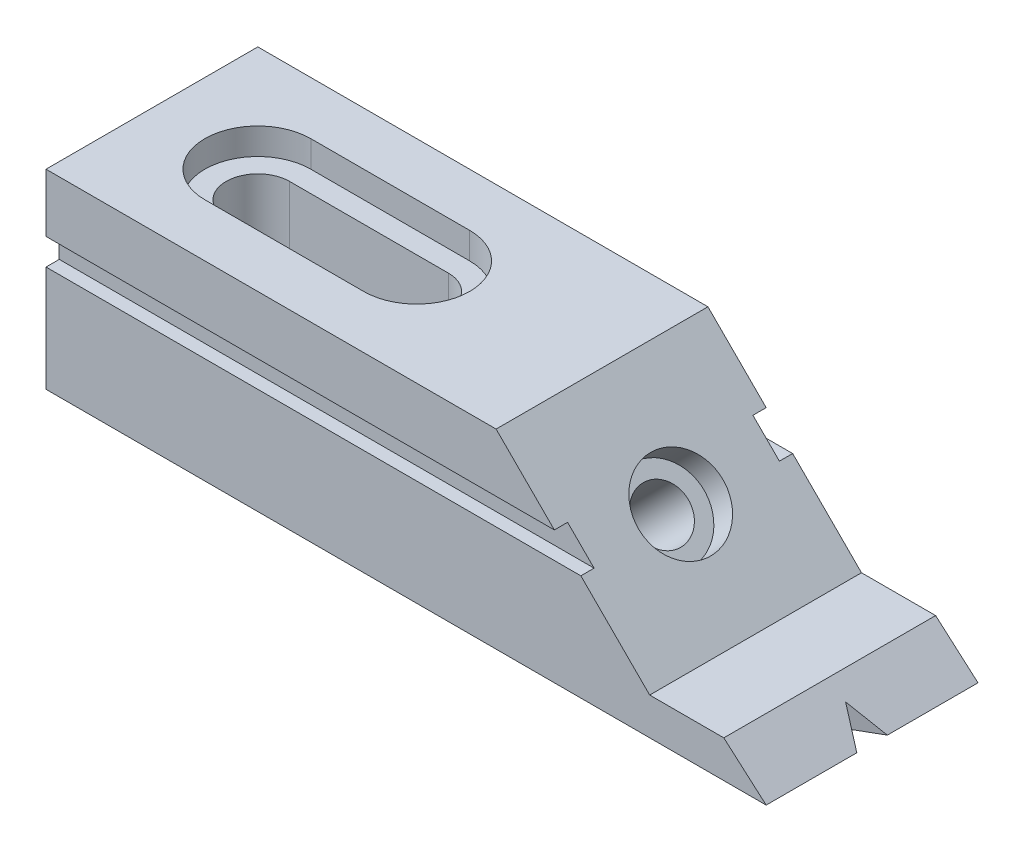
ISO-10303-21;
HEADER;
FILE_DESCRIPTION(('STEP AP214'),'2;1');
FILE_NAME('part.step','',(''),(''),'','','');
FILE_SCHEMA(('AUTOMOTIVE_DESIGN { 1 0 10303 214 1 1 1 1 }'));
ENDSEC;
DATA;
#1=APPLICATION_CONTEXT('core data for automotive mechanical design processes');
#2=APPLICATION_PROTOCOL_DEFINITION('international standard','automotive_design',2000,#1);
#3=PRODUCT_CONTEXT('',#1,'mechanical');
#4=PRODUCT('Part','Part','',(#3));
#5=PRODUCT_RELATED_PRODUCT_CATEGORY('part','',(#4));
#6=PRODUCT_DEFINITION_FORMATION('','',#4);
#7=PRODUCT_DEFINITION_CONTEXT('part definition',#1,'design');
#8=PRODUCT_DEFINITION('design','',#6,#7);
#9=PRODUCT_DEFINITION_SHAPE('','',#8);
#10=(LENGTH_UNIT() NAMED_UNIT(*) SI_UNIT(.MILLI.,.METRE.));
#11=(NAMED_UNIT(*) PLANE_ANGLE_UNIT() SI_UNIT($,.RADIAN.));
#12=(NAMED_UNIT(*) SI_UNIT($,.STERADIAN.) SOLID_ANGLE_UNIT());
#13=UNCERTAINTY_MEASURE_WITH_UNIT(LENGTH_MEASURE(1.E-05),#10,'distance_accuracy_value','');
#14=(GEOMETRIC_REPRESENTATION_CONTEXT(3) GLOBAL_UNCERTAINTY_ASSIGNED_CONTEXT((#13)) GLOBAL_UNIT_ASSIGNED_CONTEXT((#10,
#11,#12)) REPRESENTATION_CONTEXT('',''));
#15=CARTESIAN_POINT('',(0.,0.,0.));
#16=DIRECTION('',(0.,0.,1.));
#17=DIRECTION('',(1.,0.,0.));
#18=AXIS2_PLACEMENT_3D('',#15,#16,#17);
#19=CARTESIAN_POINT('',(0.,45.72,25.4));
#20=DIRECTION('',(1.,0.,0.));
#21=DIRECTION('',(0.,0.,-1.));
#22=AXIS2_PLACEMENT_3D('',#19,#20,#21);
#23=PLANE('',#22);
#24=DIRECTION('',(0.,0.,-1.));
#25=VECTOR('',#24,1.);
#26=CARTESIAN_POINT('',(0.,25.4,22.225));
#27=LINE('',#26,#25);
#28=CARTESIAN_POINT('',(0.,25.4,25.4));
#29=VERTEX_POINT('',#28);
#30=CARTESIAN_POINT('',(0.,25.4,22.225));
#31=VERTEX_POINT('',#30);
#32=EDGE_CURVE('E297',#29,#31,#27,.T.);
#33=ORIENTED_EDGE('',*,*,#32,.T.);
#34=DIRECTION('',(0.,1.,0.));
#35=VECTOR('',#34,1.);
#36=CARTESIAN_POINT('',(0.,31.75,22.225));
#37=LINE('',#36,#35);
#38=CARTESIAN_POINT('',(0.,31.75,22.225));
#39=VERTEX_POINT('',#38);
#40=EDGE_CURVE('E301',#31,#39,#37,.T.);
#41=ORIENTED_EDGE('',*,*,#40,.T.);
#42=DIRECTION('',(0.,0.,1.));
#43=VECTOR('',#42,1.);
#44=CARTESIAN_POINT('',(0.,31.75,25.4));
#45=LINE('',#44,#43);
#46=CARTESIAN_POINT('',(0.,31.75,25.4));
#47=VERTEX_POINT('',#46);
#48=EDGE_CURVE('E306',#39,#47,#45,.T.);
#49=ORIENTED_EDGE('',*,*,#48,.T.);
#50=DIRECTION('',(0.,-1.,0.));
#51=VECTOR('',#50,1.);
#52=CARTESIAN_POINT('',(0.,45.72,25.4));
#53=LINE('',#52,#51);
#54=CARTESIAN_POINT('',(0.,45.72,25.4));
#55=VERTEX_POINT('',#54);
#56=EDGE_CURVE('E370',#55,#47,#53,.T.);
#57=ORIENTED_EDGE('',*,*,#56,.F.);
#58=DIRECTION('',(0.,0.,-1.));
#59=VECTOR('',#58,1.);
#60=CARTESIAN_POINT('',(0.,45.72,25.4));
#61=LINE('',#60,#59);
#62=CARTESIAN_POINT('',(0.,45.72,-25.4));
#63=VERTEX_POINT('',#62);
#64=EDGE_CURVE('E392',#55,#63,#61,.T.);
#65=ORIENTED_EDGE('',*,*,#64,.T.);
#66=DIRECTION('',(0.,-1.,0.));
#67=VECTOR('',#66,1.);
#68=CARTESIAN_POINT('',(0.,45.72,-25.4));
#69=LINE('',#68,#67);
#70=CARTESIAN_POINT('',(0.,31.75,-25.4));
#71=VERTEX_POINT('',#70);
#72=EDGE_CURVE('E393',#63,#71,#69,.T.);
#73=ORIENTED_EDGE('',*,*,#72,.T.);
#74=DIRECTION('',(0.,0.,1.));
#75=VECTOR('',#74,1.);
#76=CARTESIAN_POINT('',(0.,31.75,-25.4));
#77=LINE('',#76,#75);
#78=CARTESIAN_POINT('',(0.,31.75,-22.225));
#79=VERTEX_POINT('',#78);
#80=EDGE_CURVE('E302',#71,#79,#77,.T.);
#81=ORIENTED_EDGE('',*,*,#80,.T.);
#82=DIRECTION('',(0.,-1.,0.));
#83=VECTOR('',#82,1.);
#84=CARTESIAN_POINT('',(0.,31.75,-22.225));
#85=LINE('',#84,#83);
#86=CARTESIAN_POINT('',(0.,25.4,-22.225));
#87=VERTEX_POINT('',#86);
#88=EDGE_CURVE('E326',#79,#87,#85,.T.);
#89=ORIENTED_EDGE('',*,*,#88,.T.);
#90=DIRECTION('',(0.,0.,-1.));
#91=VECTOR('',#90,1.);
#92=CARTESIAN_POINT('',(0.,25.4,-22.225));
#93=LINE('',#92,#91);
#94=CARTESIAN_POINT('',(0.,25.4,-25.4));
#95=VERTEX_POINT('',#94);
#96=EDGE_CURVE('E322',#87,#95,#93,.T.);
#97=ORIENTED_EDGE('',*,*,#96,.T.);
#98=CARTESIAN_POINT('',(0.,0.,-25.4));
#99=VERTEX_POINT('',#98);
#100=EDGE_CURVE('E369',#95,#99,#69,.T.);
#101=ORIENTED_EDGE('',*,*,#100,.T.);
#102=DIRECTION('',(0.,0.,-1.));
#103=VECTOR('',#102,1.);
#104=CARTESIAN_POINT('',(0.,0.,25.4));
#105=LINE('',#104,#103);
#106=CARTESIAN_POINT('',(0.,0.,25.4));
#107=VERTEX_POINT('',#106);
#108=EDGE_CURVE('E435',#107,#99,#105,.T.);
#109=ORIENTED_EDGE('',*,*,#108,.F.);
#110=EDGE_CURVE('E375',#29,#107,#53,.T.);
#111=ORIENTED_EDGE('',*,*,#110,.F.);
#112=EDGE_LOOP('',(#33,#41,#49,#57,#65,#73,#81,#89,#97,#101,#109,#111));
#113=FACE_BOUND('',#112,.T.);
#114=ADVANCED_FACE('F43',(#113),#23,.F.);
#115=CARTESIAN_POINT('',(144.78,8.89,25.4));
#116=DIRECTION('',(-0.707106781186548,-0.707106781186547,0.));
#117=DIRECTION('',(0.707106781186547,-0.707106781186548,0.));
#118=AXIS2_PLACEMENT_3D('',#115,#116,#117);
#119=PLANE('',#118);
#120=CARTESIAN_POINT('',(126.819487757862,26.8505122421383,0.));
#121=DIRECTION('',(0.707106781186548,0.707106781186547,0.));
#122=DIRECTION('',(-0.707106781186547,0.707106781186548,0.));
#123=AXIS2_PLACEMENT_3D('',#120,#121,#122);
#124=CIRCLE('',#123,10.16);
#125=CARTESIAN_POINT('',(119.635282861006,34.0347171389937,0.));
#126=VERTEX_POINT('',#125);
#127=EDGE_CURVE('E356',#126,#126,#124,.T.);
#128=ORIENTED_EDGE('',*,*,#127,.F.);
#129=EDGE_LOOP('',(#128));
#130=FACE_BOUND('',#129,.T.);
#131=DIRECTION('',(0.,0.,-1.));
#132=VECTOR('',#131,1.);
#133=CARTESIAN_POINT('',(128.27,25.4,25.4));
#134=LINE('',#133,#132);
#135=CARTESIAN_POINT('',(128.27,25.4,25.4));
#136=VERTEX_POINT('',#135);
#137=CARTESIAN_POINT('',(128.27,25.4,22.225));
#138=VERTEX_POINT('',#137);
#139=EDGE_CURVE('E341',#136,#138,#134,.T.);
#140=ORIENTED_EDGE('',*,*,#139,.F.);
#141=DIRECTION('',(-0.707106781186547,0.707106781186548,0.));
#142=VECTOR('',#141,1.);
#143=CARTESIAN_POINT('',(144.78,8.89,25.4));
#144=LINE('',#143,#142);
#145=CARTESIAN_POINT('',(144.78,8.89,25.4));
#146=VERTEX_POINT('',#145);
#147=EDGE_CURVE('E385',#146,#136,#144,.T.);
#148=ORIENTED_EDGE('',*,*,#147,.F.);
#149=DIRECTION('',(0.,0.,-1.));
#150=VECTOR('',#149,1.);
#151=CARTESIAN_POINT('',(144.78,8.89,25.4));
#152=LINE('',#151,#150);
#153=CARTESIAN_POINT('',(144.78,8.89,-25.4));
#154=VERTEX_POINT('',#153);
#155=EDGE_CURVE('E422',#146,#154,#152,.T.);
#156=ORIENTED_EDGE('',*,*,#155,.T.);
#157=DIRECTION('',(-0.707106781186547,0.707106781186548,0.));
#158=VECTOR('',#157,1.);
#159=CARTESIAN_POINT('',(144.78,8.89,-25.4));
#160=LINE('',#159,#158);
#161=CARTESIAN_POINT('',(128.27,25.4,-25.4));
#162=VERTEX_POINT('',#161);
#163=EDGE_CURVE('E408',#154,#162,#160,.T.);
#164=ORIENTED_EDGE('',*,*,#163,.T.);
#165=DIRECTION('',(0.,0.,-1.));
#166=VECTOR('',#165,1.);
#167=CARTESIAN_POINT('',(128.27,25.4,25.4));
#168=LINE('',#167,#166);
#169=CARTESIAN_POINT('',(128.27,25.4,-22.225));
#170=VERTEX_POINT('',#169);
#171=EDGE_CURVE('E316',#170,#162,#168,.T.);
#172=ORIENTED_EDGE('',*,*,#171,.F.);
#173=DIRECTION('',(0.707106781186547,-0.707106781186548,0.));
#174=VECTOR('',#173,1.);
#175=CARTESIAN_POINT('',(144.78,8.89,-22.225));
#176=LINE('',#175,#174);
#177=CARTESIAN_POINT('',(121.92,31.75,-22.225));
#178=VERTEX_POINT('',#177);
#179=EDGE_CURVE('E51',#178,#170,#176,.T.);
#180=ORIENTED_EDGE('',*,*,#179,.F.);
#181=DIRECTION('',(0.,0.,1.));
#182=VECTOR('',#181,1.);
#183=CARTESIAN_POINT('',(121.92,31.75,25.4));
#184=LINE('',#183,#182);
#185=CARTESIAN_POINT('',(121.92,31.75,-25.4));
#186=VERTEX_POINT('',#185);
#187=EDGE_CURVE('E335',#186,#178,#184,.T.);
#188=ORIENTED_EDGE('',*,*,#187,.F.);
#189=CARTESIAN_POINT('',(107.95,45.72,-25.4));
#190=VERTEX_POINT('',#189);
#191=EDGE_CURVE('E407',#186,#190,#160,.T.);
#192=ORIENTED_EDGE('',*,*,#191,.T.);
#193=DIRECTION('',(0.,0.,-1.));
#194=VECTOR('',#193,1.);
#195=CARTESIAN_POINT('',(107.95,45.72,25.4));
#196=LINE('',#195,#194);
#197=CARTESIAN_POINT('',(107.95,45.72,25.4));
#198=VERTEX_POINT('',#197);
#199=EDGE_CURVE('E418',#198,#190,#196,.T.);
#200=ORIENTED_EDGE('',*,*,#199,.F.);
#201=CARTESIAN_POINT('',(121.92,31.75,25.4));
#202=VERTEX_POINT('',#201);
#203=EDGE_CURVE('E384',#202,#198,#144,.T.);
#204=ORIENTED_EDGE('',*,*,#203,.F.);
#205=DIRECTION('',(0.,0.,1.));
#206=VECTOR('',#205,1.);
#207=CARTESIAN_POINT('',(121.92,31.75,25.4));
#208=LINE('',#207,#206);
#209=CARTESIAN_POINT('',(121.92,31.75,22.225));
#210=VERTEX_POINT('',#209);
#211=EDGE_CURVE('E338',#210,#202,#208,.T.);
#212=ORIENTED_EDGE('',*,*,#211,.F.);
#213=DIRECTION('',(-0.707106781186547,0.707106781186548,0.));
#214=VECTOR('',#213,1.);
#215=CARTESIAN_POINT('',(144.78,8.89,22.225));
#216=LINE('',#215,#214);
#217=EDGE_CURVE('E11',#138,#210,#216,.T.);
#218=ORIENTED_EDGE('',*,*,#217,.F.);
#219=EDGE_LOOP('',(#140,#148,#156,#164,#172,#180,#188,#192,#200,#204,#212,#218));
#220=FACE_BOUND('',#219,.T.);
#221=ADVANCED_FACE('F478',(#130,#220),#119,.F.);
#222=CARTESIAN_POINT('',(0.,0.,25.4));
#223=DIRECTION('',(0.,0.,1.));
#224=DIRECTION('',(1.,0.,0.));
#225=AXIS2_PLACEMENT_3D('',#222,#223,#224);
#226=PLANE('',#225);
#227=ORIENTED_EDGE('',*,*,#147,.T.);
#228=DIRECTION('',(-1.,0.,0.));
#229=VECTOR('',#228,1.);
#230=CARTESIAN_POINT('',(0.,25.4,25.4));
#231=LINE('',#230,#229);
#232=EDGE_CURVE('E460',#136,#29,#231,.T.);
#233=ORIENTED_EDGE('',*,*,#232,.T.);
#234=ORIENTED_EDGE('',*,*,#110,.T.);
#235=DIRECTION('',(1.,0.,0.));
#236=VECTOR('',#235,1.);
#237=CARTESIAN_POINT('',(0.,0.,25.4));
#238=LINE('',#237,#236);
#239=CARTESIAN_POINT('',(172.72,0.,25.4));
#240=VERTEX_POINT('',#239);
#241=EDGE_CURVE('E374',#107,#240,#238,.T.);
#242=ORIENTED_EDGE('',*,*,#241,.T.);
#243=DIRECTION('',(-0.752576694706881,0.658504607868515,0.));
#244=VECTOR('',#243,1.);
#245=CARTESIAN_POINT('',(172.72,0.,25.4));
#246=LINE('',#245,#244);
#247=CARTESIAN_POINT('',(162.56,8.89,25.4));
#248=VERTEX_POINT('',#247);
#249=EDGE_CURVE('E378',#240,#248,#246,.T.);
#250=ORIENTED_EDGE('',*,*,#249,.T.);
#251=DIRECTION('',(-1.,0.,0.));
#252=VECTOR('',#251,1.);
#253=CARTESIAN_POINT('',(162.56,8.89,25.4));
#254=LINE('',#253,#252);
#255=EDGE_CURVE('E381',#248,#146,#254,.T.);
#256=ORIENTED_EDGE('',*,*,#255,.T.);
#257=EDGE_LOOP('',(#227,#233,#234,#242,#250,#256));
#258=FACE_BOUND('',#257,.T.);
#259=ADVANCED_FACE('F513',(#258),#226,.T.);
#260=ORIENTED_EDGE('',*,*,#56,.T.);
#261=DIRECTION('',(1.,0.,0.));
#262=VECTOR('',#261,1.);
#263=CARTESIAN_POINT('',(0.,31.75,25.4));
#264=LINE('',#263,#262);
#265=EDGE_CURVE('E456',#47,#202,#264,.T.);
#266=ORIENTED_EDGE('',*,*,#265,.T.);
#267=ORIENTED_EDGE('',*,*,#203,.T.);
#268=DIRECTION('',(-1.,0.,0.));
#269=VECTOR('',#268,1.);
#270=CARTESIAN_POINT('',(107.95,45.72,25.4));
#271=LINE('',#270,#269);
#272=EDGE_CURVE('E389',#198,#55,#271,.T.);
#273=ORIENTED_EDGE('',*,*,#272,.T.);
#274=EDGE_LOOP('',(#260,#266,#267,#273));
#275=FACE_BOUND('',#274,.T.);
#276=ADVANCED_FACE('F529',(#275),#226,.T.);
#277=CARTESIAN_POINT('',(0.,0.,-25.4));
#278=DIRECTION('',(0.,0.,1.));
#279=DIRECTION('',(1.,0.,0.));
#280=AXIS2_PLACEMENT_3D('',#277,#278,#279);
#281=PLANE('',#280);
#282=DIRECTION('',(1.,0.,0.));
#283=VECTOR('',#282,1.);
#284=CARTESIAN_POINT('',(0.,31.75,-25.4));
#285=LINE('',#284,#283);
#286=EDGE_CURVE('E453',#71,#186,#285,.T.);
#287=ORIENTED_EDGE('',*,*,#286,.F.);
#288=ORIENTED_EDGE('',*,*,#72,.F.);
#289=DIRECTION('',(-1.,0.,0.));
#290=VECTOR('',#289,1.);
#291=CARTESIAN_POINT('',(107.95,45.72,-25.4));
#292=LINE('',#291,#290);
#293=EDGE_CURVE('E412',#190,#63,#292,.T.);
#294=ORIENTED_EDGE('',*,*,#293,.F.);
#295=ORIENTED_EDGE('',*,*,#191,.F.);
#296=EDGE_LOOP('',(#287,#288,#294,#295));
#297=FACE_BOUND('',#296,.T.);
#298=ADVANCED_FACE('F496',(#297),#281,.F.);
#299=DIRECTION('',(-1.,0.,0.));
#300=VECTOR('',#299,1.);
#301=CARTESIAN_POINT('',(0.,25.4,-25.4));
#302=LINE('',#301,#300);
#303=EDGE_CURVE('E450',#162,#95,#302,.T.);
#304=ORIENTED_EDGE('',*,*,#303,.F.);
#305=ORIENTED_EDGE('',*,*,#163,.F.);
#306=DIRECTION('',(-1.,0.,0.));
#307=VECTOR('',#306,1.);
#308=CARTESIAN_POINT('',(162.56,8.89,-25.4));
#309=LINE('',#308,#307);
#310=CARTESIAN_POINT('',(162.56,8.89,-25.4));
#311=VERTEX_POINT('',#310);
#312=EDGE_CURVE('E404',#311,#154,#309,.T.);
#313=ORIENTED_EDGE('',*,*,#312,.F.);
#314=DIRECTION('',(-0.752576694706881,0.658504607868515,0.));
#315=VECTOR('',#314,1.);
#316=CARTESIAN_POINT('',(172.72,0.,-25.4));
#317=LINE('',#316,#315);
#318=CARTESIAN_POINT('',(172.72,0.,-25.4));
#319=VERTEX_POINT('',#318);
#320=EDGE_CURVE('E401',#319,#311,#317,.T.);
#321=ORIENTED_EDGE('',*,*,#320,.F.);
#322=DIRECTION('',(1.,0.,0.));
#323=VECTOR('',#322,1.);
#324=CARTESIAN_POINT('',(0.,0.,-25.4));
#325=LINE('',#324,#323);
#326=EDGE_CURVE('E397',#99,#319,#325,.T.);
#327=ORIENTED_EDGE('',*,*,#326,.F.);
#328=ORIENTED_EDGE('',*,*,#100,.F.);
#329=EDGE_LOOP('',(#304,#305,#313,#321,#327,#328));
#330=FACE_BOUND('',#329,.T.);
#331=ADVANCED_FACE('F484',(#330),#281,.F.);
#332=CARTESIAN_POINT('',(49.9844877578615,-49.9844877578616,0.));
#333=DIRECTION('',(0.707106781186548,0.707106781186547,0.));
#334=DIRECTION('',(-0.707106781186547,0.707106781186548,0.));
#335=AXIS2_PLACEMENT_3D('',#332,#333,#334);
#336=CYLINDRICAL_SURFACE('',#335,6.34999999999999);
#337=CARTESIAN_POINT('',(99.9689755157232,0.,0.));
#338=DIRECTION('',(0.,1.,0.));
#339=DIRECTION('',(1.,0.,0.));
#340=AXIS2_PLACEMENT_3D('',#337,#338,#339);
#341=ELLIPSE('',#340,8.98025612106916,6.34999999999999);
#342=CARTESIAN_POINT('',(108.949231636792,0.,0.));
#343=VERTEX_POINT('',#342);
#344=EDGE_CURVE('E365',#343,#343,#341,.T.);
#345=ORIENTED_EDGE('',*,*,#344,.F.);
#346=EDGE_LOOP('',(#345));
#347=FACE_BOUND('',#346,.T.);
#348=CARTESIAN_POINT('',(122.329359697327,22.3603841816038,0.));
#349=DIRECTION('',(0.707106781186548,0.707106781186547,0.));
#350=DIRECTION('',(-0.707106781186547,0.707106781186548,0.));
#351=AXIS2_PLACEMENT_3D('',#348,#349,#350);
#352=CIRCLE('',#351,6.34999999999999);
#353=CARTESIAN_POINT('',(117.839231636792,26.8505122421384,0.));
#354=VERTEX_POINT('',#353);
#355=EDGE_CURVE('E361',#354,#354,#352,.F.);
#356=ORIENTED_EDGE('',*,*,#355,.F.);
#357=EDGE_LOOP('',(#356));
#358=FACE_BOUND('',#357,.T.);
#359=ADVANCED_FACE('F564',(#347,#358),#336,.F.);
#360=CARTESIAN_POINT('',(0.,0.,25.4));
#361=DIRECTION('',(0.,1.,0.));
#362=DIRECTION('',(0.,0.,1.));
#363=AXIS2_PLACEMENT_3D('',#360,#361,#362);
#364=PLANE('',#363);
#365=DIRECTION('',(-1.,0.,0.));
#366=VECTOR('',#365,1.);
#367=CARTESIAN_POINT('',(63.5,0.,-7.62));
#368=LINE('',#367,#366);
#369=CARTESIAN_POINT('',(63.5,0.,-7.62));
#370=VERTEX_POINT('',#369);
#371=CARTESIAN_POINT('',(25.4,0.,-7.62));
#372=VERTEX_POINT('',#371);
#373=EDGE_CURVE('E215',#370,#372,#368,.T.);
#374=ORIENTED_EDGE('',*,*,#373,.T.);
#375=CARTESIAN_POINT('',(25.4,0.,0.));
#376=DIRECTION('',(0.,1.,0.));
#377=DIRECTION('',(-1.,0.,0.));
#378=AXIS2_PLACEMENT_3D('',#375,#376,#377);
#379=CIRCLE('',#378,7.62);
#380=CARTESIAN_POINT('',(25.4,0.,7.62));
#381=VERTEX_POINT('',#380);
#382=EDGE_CURVE('E206',#372,#381,#379,.T.);
#383=ORIENTED_EDGE('',*,*,#382,.T.);
#384=DIRECTION('',(1.,0.,0.));
#385=VECTOR('',#384,1.);
#386=CARTESIAN_POINT('',(25.4,0.,7.62));
#387=LINE('',#386,#385);
#388=CARTESIAN_POINT('',(63.5,0.,7.62));
#389=VERTEX_POINT('',#388);
#390=EDGE_CURVE('E218',#381,#389,#387,.T.);
#391=ORIENTED_EDGE('',*,*,#390,.T.);
#392=CARTESIAN_POINT('',(63.5,0.,0.));
#393=DIRECTION('',(0.,1.,0.));
#394=DIRECTION('',(-1.,0.,0.));
#395=AXIS2_PLACEMENT_3D('',#392,#393,#394);
#396=CIRCLE('',#395,7.62);
#397=EDGE_CURVE('E63',#389,#370,#396,.T.);
#398=ORIENTED_EDGE('',*,*,#397,.T.);
#399=EDGE_LOOP('',(#374,#383,#391,#398));
#400=FACE_BOUND('',#399,.T.);
#401=ORIENTED_EDGE('',*,*,#344,.T.);
#402=EDGE_LOOP('',(#401));
#403=FACE_BOUND('',#402,.T.);
#404=DIRECTION('',(-0.86602540378444,0.,0.499999999999998));
#405=VECTOR('',#404,1.);
#406=CARTESIAN_POINT('',(166.37,0.,0.));
#407=LINE('',#406,#405);
#408=CARTESIAN_POINT('',(172.72,0.,-3.6661742093541));
#409=VERTEX_POINT('',#408);
#410=CARTESIAN_POINT('',(166.37,0.,0.));
#411=VERTEX_POINT('',#410);
#412=EDGE_CURVE('E348',#409,#411,#407,.T.);
#413=ORIENTED_EDGE('',*,*,#412,.T.);
#414=DIRECTION('',(0.86602540378444,0.,0.499999999999998));
#415=VECTOR('',#414,1.);
#416=CARTESIAN_POINT('',(177.602369566769,0.,6.48501159301155));
#417=LINE('',#416,#415);
#418=CARTESIAN_POINT('',(172.72,0.,3.6661742093541));
#419=VERTEX_POINT('',#418);
#420=EDGE_CURVE('E344',#411,#419,#417,.T.);
#421=ORIENTED_EDGE('',*,*,#420,.T.);
#422=DIRECTION('',(0.,0.,-1.));
#423=VECTOR('',#422,1.);
#424=CARTESIAN_POINT('',(172.72,0.,25.4));
#425=LINE('',#424,#423);
#426=EDGE_CURVE('E431',#240,#419,#425,.T.);
#427=ORIENTED_EDGE('',*,*,#426,.F.);
#428=ORIENTED_EDGE('',*,*,#241,.F.);
#429=ORIENTED_EDGE('',*,*,#108,.T.);
#430=ORIENTED_EDGE('',*,*,#326,.T.);
#431=EDGE_CURVE('E430',#409,#319,#425,.T.);
#432=ORIENTED_EDGE('',*,*,#431,.F.);
#433=EDGE_LOOP('',(#413,#421,#427,#428,#429,#430,#432));
#434=FACE_BOUND('',#433,.T.);
#435=ADVANCED_FACE('F223',(#400,#403,#434),#364,.F.);
#436=CARTESIAN_POINT('',(172.72,0.,25.4));
#437=DIRECTION('',(-0.658504607868515,-0.752576694706881,0.));
#438=DIRECTION('',(0.752576694706881,-0.658504607868515,0.));
#439=AXIS2_PLACEMENT_3D('',#436,#437,#438);
#440=PLANE('',#439);
#441=ORIENTED_EDGE('',*,*,#426,.T.);
#442=DIRECTION('',(-0.690236770251664,0.6039571739702,-0.398508385109374));
#443=VECTOR('',#442,1.);
#444=CARTESIAN_POINT('',(178.698217848099,-5.23094061708675,7.11769989322838));
#445=LINE('',#444,#443);
#446=CARTESIAN_POINT('',(166.37,5.55624999999995,0.));
#447=VERTEX_POINT('',#446);
#448=EDGE_CURVE('E446',#419,#447,#445,.T.);
#449=ORIENTED_EDGE('',*,*,#448,.T.);
#450=DIRECTION('',(0.690236770251664,-0.6039571739702,-0.398508385109374));
#451=VECTOR('',#450,1.);
#452=CARTESIAN_POINT('',(164.724908702769,6.99570488507681,0.94979390329766));
#453=LINE('',#452,#451);
#454=EDGE_CURVE('E439',#447,#409,#453,.T.);
#455=ORIENTED_EDGE('',*,*,#454,.T.);
#456=ORIENTED_EDGE('',*,*,#431,.T.);
#457=ORIENTED_EDGE('',*,*,#320,.T.);
#458=DIRECTION('',(0.,0.,-1.));
#459=VECTOR('',#458,1.);
#460=CARTESIAN_POINT('',(162.56,8.89,25.4));
#461=LINE('',#460,#459);
#462=EDGE_CURVE('E426',#248,#311,#461,.T.);
#463=ORIENTED_EDGE('',*,*,#462,.F.);
#464=ORIENTED_EDGE('',*,*,#249,.F.);
#465=EDGE_LOOP('',(#441,#449,#455,#456,#457,#463,#464));
#466=FACE_BOUND('',#465,.T.);
#467=ADVANCED_FACE('F506',(#466),#440,.F.);
#468=CARTESIAN_POINT('',(162.56,8.89,25.4));
#469=DIRECTION('',(0.,-1.,0.));
#470=DIRECTION('',(0.,0.,-1.));
#471=AXIS2_PLACEMENT_3D('',#468,#469,#470);
#472=PLANE('',#471);
#473=ORIENTED_EDGE('',*,*,#312,.T.);
#474=ORIENTED_EDGE('',*,*,#155,.F.);
#475=ORIENTED_EDGE('',*,*,#255,.F.);
#476=ORIENTED_EDGE('',*,*,#462,.T.);
#477=EDGE_LOOP('',(#473,#474,#475,#476));
#478=FACE_BOUND('',#477,.T.);
#479=ADVANCED_FACE('F536',(#478),#472,.F.);
#480=CARTESIAN_POINT('',(107.95,45.72,25.4));
#481=DIRECTION('',(0.,-1.,0.));
#482=DIRECTION('',(1.,0.,0.));
#483=AXIS2_PLACEMENT_3D('',#480,#481,#482);
#484=PLANE('',#483);
#485=DIRECTION('',(1.,0.,0.));
#486=VECTOR('',#485,1.);
#487=CARTESIAN_POINT('',(25.4,45.72,12.7));
#488=LINE('',#487,#486);
#489=CARTESIAN_POINT('',(25.4,45.72,12.7));
#490=VERTEX_POINT('',#489);
#491=CARTESIAN_POINT('',(63.5,45.72,12.7));
#492=VERTEX_POINT('',#491);
#493=EDGE_CURVE('E273',#490,#492,#488,.T.);
#494=ORIENTED_EDGE('',*,*,#493,.F.);
#495=CARTESIAN_POINT('',(25.4,45.72,0.));
#496=DIRECTION('',(0.,1.,0.));
#497=DIRECTION('',(-1.,0.,0.));
#498=AXIS2_PLACEMENT_3D('',#495,#496,#497);
#499=CIRCLE('',#498,12.7);
#500=CARTESIAN_POINT('',(25.4,45.72,-12.7));
#501=VERTEX_POINT('',#500);
#502=EDGE_CURVE('E247',#501,#490,#499,.T.);
#503=ORIENTED_EDGE('',*,*,#502,.F.);
#504=DIRECTION('',(-1.,0.,0.));
#505=VECTOR('',#504,1.);
#506=CARTESIAN_POINT('',(25.4,45.72,-12.7));
#507=LINE('',#506,#505);
#508=CARTESIAN_POINT('',(63.5,45.72,-12.7));
#509=VERTEX_POINT('',#508);
#510=EDGE_CURVE('E258',#509,#501,#507,.T.);
#511=ORIENTED_EDGE('',*,*,#510,.F.);
#512=CARTESIAN_POINT('',(63.5,45.72,0.));
#513=DIRECTION('',(0.,1.,0.));
#514=DIRECTION('',(-1.,0.,0.));
#515=AXIS2_PLACEMENT_3D('',#512,#513,#514);
#516=CIRCLE('',#515,12.7);
#517=EDGE_CURVE('E277',#492,#509,#516,.T.);
#518=ORIENTED_EDGE('',*,*,#517,.F.);
#519=EDGE_LOOP('',(#494,#503,#511,#518));
#520=FACE_BOUND('',#519,.T.);
#521=ORIENTED_EDGE('',*,*,#293,.T.);
#522=ORIENTED_EDGE('',*,*,#64,.F.);
#523=ORIENTED_EDGE('',*,*,#272,.F.);
#524=ORIENTED_EDGE('',*,*,#199,.T.);
#525=EDGE_LOOP('',(#521,#522,#523,#524));
#526=FACE_BOUND('',#525,.T.);
#527=ADVANCED_FACE('F533',(#520,#526),#484,.F.);
#528=CARTESIAN_POINT('',(122.329359697327,22.3603841816038,0.));
#529=DIRECTION('',(0.707106781186548,0.707106781186547,0.));
#530=DIRECTION('',(-0.707106781186547,0.707106781186548,0.));
#531=AXIS2_PLACEMENT_3D('',#528,#529,#530);
#532=PLANE('',#531);
#533=CARTESIAN_POINT('',(122.329359697327,22.3603841816038,0.));
#534=DIRECTION('',(0.707106781186548,0.707106781186547,0.));
#535=DIRECTION('',(-0.707106781186547,0.707106781186548,0.));
#536=AXIS2_PLACEMENT_3D('',#533,#534,#535);
#537=CIRCLE('',#536,10.16);
#538=CARTESIAN_POINT('',(115.145154800472,29.5445890784591,0.));
#539=VERTEX_POINT('',#538);
#540=EDGE_CURVE('E357',#539,#539,#537,.T.);
#541=ORIENTED_EDGE('',*,*,#540,.T.);
#542=EDGE_LOOP('',(#541));
#543=FACE_BOUND('',#542,.T.);
#544=ORIENTED_EDGE('',*,*,#355,.T.);
#545=EDGE_LOOP('',(#544));
#546=FACE_BOUND('',#545,.T.);
#547=ADVANCED_FACE('F535',(#543,#546),#532,.T.);
#548=CARTESIAN_POINT('',(122.329359697327,22.3603841816038,0.));
#549=DIRECTION('',(0.707106781186548,0.707106781186547,0.));
#550=DIRECTION('',(-0.707106781186547,0.707106781186548,0.));
#551=AXIS2_PLACEMENT_3D('',#548,#549,#550);
#552=CYLINDRICAL_SURFACE('',#551,10.16);
#553=CARTESIAN_POINT('',(115.145154800472,29.5445890784591,0.));
#554=CARTESIAN_POINT('',(115.191926967769,29.5913612457563,0.));
#555=CARTESIAN_POINT('',(115.238699135066,29.6381334130536,0.));
#556=CARTESIAN_POINT('',(115.332243469661,29.731677747648,0.));
#557=CARTESIAN_POINT('',(115.379015636958,29.7784499149453,0.));
#558=CARTESIAN_POINT('',(115.472559971552,29.8719942495397,0.));
#559=CARTESIAN_POINT('',(115.51933213885,29.918766416837,0.));
#560=CARTESIAN_POINT('',(115.612876473444,30.0123107514314,0.));
#561=CARTESIAN_POINT('',(115.659648640741,30.0590829187287,0.));
#562=CARTESIAN_POINT('',(115.753192975336,30.1526272533232,0.));
#563=CARTESIAN_POINT('',(115.799965142633,30.1993994206204,0.));
#564=CARTESIAN_POINT('',(115.893509477227,30.2929437552149,0.));
#565=CARTESIAN_POINT('',(115.940281644525,30.3397159225121,0.));
#566=CARTESIAN_POINT('',(116.033825979119,30.4332602571066,0.));
#567=CARTESIAN_POINT('',(116.080598146416,30.4800324244038,0.));
#568=CARTESIAN_POINT('',(116.174142481011,30.5735767589983,0.));
#569=CARTESIAN_POINT('',(116.220914648308,30.6203489262955,0.));
#570=CARTESIAN_POINT('',(116.314458982903,30.71389326089,0.));
#571=CARTESIAN_POINT('',(116.3612311502,30.7606654281872,0.));
#572=CARTESIAN_POINT('',(116.454775484794,30.8542097627817,0.));
#573=CARTESIAN_POINT('',(116.501547652092,30.9009819300789,0.));
#574=CARTESIAN_POINT('',(116.595091986686,30.9945262646734,0.));
#575=CARTESIAN_POINT('',(116.641864153983,31.0412984319706,0.));
#576=CARTESIAN_POINT('',(116.735408488578,31.1348427665651,0.));
#577=CARTESIAN_POINT('',(116.782180655875,31.1816149338623,0.));
#578=CARTESIAN_POINT('',(116.875724990469,31.2751592684568,0.));
#579=CARTESIAN_POINT('',(116.922497157767,31.321931435754,0.));
#580=CARTESIAN_POINT('',(117.016041492361,31.4154757703485,0.));
#581=CARTESIAN_POINT('',(117.062813659658,31.4622479376457,0.));
#582=CARTESIAN_POINT('',(117.156357994253,31.5557922722402,0.));
#583=CARTESIAN_POINT('',(117.20313016155,31.6025644395374,0.));
#584=CARTESIAN_POINT('',(117.296674496145,31.6961087741319,0.));
#585=CARTESIAN_POINT('',(117.343446663442,31.7428809414291,0.));
#586=CARTESIAN_POINT('',(117.436990998036,31.8364252760236,0.));
#587=CARTESIAN_POINT('',(117.483763165333,31.8831974433209,0.));
#588=CARTESIAN_POINT('',(117.577307499928,31.9767417779153,0.));
#589=CARTESIAN_POINT('',(117.624079667225,32.0235139452126,0.));
#590=CARTESIAN_POINT('',(117.71762400182,32.117058279807,0.));
#591=CARTESIAN_POINT('',(117.764396169117,32.1638304471043,0.));
#592=CARTESIAN_POINT('',(117.857940503711,32.2573747816987,0.));
#593=CARTESIAN_POINT('',(117.904712671009,32.304146948996,0.));
#594=CARTESIAN_POINT('',(117.998257005603,32.3976912835904,0.));
#595=CARTESIAN_POINT('',(118.0450291729,32.4444634508877,0.));
#596=CARTESIAN_POINT('',(118.138573507495,32.5380077854821,0.));
#597=CARTESIAN_POINT('',(118.185345674792,32.5847799527794,0.));
#598=CARTESIAN_POINT('',(118.278890009387,32.6783242873738,0.));
#599=CARTESIAN_POINT('',(118.325662176684,32.7250964546711,0.));
#600=CARTESIAN_POINT('',(118.419206511278,32.8186407892656,0.));
#601=CARTESIAN_POINT('',(118.465978678575,32.8654129565628,0.));
#602=CARTESIAN_POINT('',(118.55952301317,32.9589572911573,0.));
#603=CARTESIAN_POINT('',(118.606295180467,33.0057294584545,0.));
#604=CARTESIAN_POINT('',(118.699839515062,33.099273793049,0.));
#605=CARTESIAN_POINT('',(118.746611682359,33.1460459603462,0.));
#606=CARTESIAN_POINT('',(118.840156016953,33.2395902949407,0.));
#607=CARTESIAN_POINT('',(118.886928184251,33.2863624622379,0.));
#608=CARTESIAN_POINT('',(118.980472518845,33.3799067968324,0.));
#609=CARTESIAN_POINT('',(119.027244686142,33.4266789641296,0.));
#610=CARTESIAN_POINT('',(119.120789020737,33.5202232987241,0.));
#611=CARTESIAN_POINT('',(119.167561188034,33.5669954660213,0.));
#612=CARTESIAN_POINT('',(119.261105522628,33.6605398006158,0.));
#613=CARTESIAN_POINT('',(119.307877689926,33.707311967913,0.));
#614=CARTESIAN_POINT('',(119.40142202452,33.8008563025075,0.));
#615=CARTESIAN_POINT('',(119.448194191817,33.8476284698047,0.));
#616=CARTESIAN_POINT('',(119.541738526412,33.9411728043992,0.));
#617=CARTESIAN_POINT('',(119.588510693709,33.9879449716964,0.));
#618=CARTESIAN_POINT('',(119.635282861006,34.0347171389937,0.));
#619=B_SPLINE_CURVE_WITH_KNOTS('',3,(#553,#554,#555,#556,#557,#558,#559,#560,#561,#562,#563,
#564,#565,#566,#567,#568,#569,#570,#571,#572,#573,#574,#575,#576,#577,#578,#579,#580,#581,#582,
#583,#584,#585,#586,#587,#588,#589,#590,#591,#592,#593,#594,#595,#596,#597,#598,#599,#600,#601,
#602,#603,#604,#605,#606,#607,#608,#609,#610,#611,#612,#613,#614,#615,#616,#617,#618),
.UNSPECIFIED.,.F.,.F.,(4,2,2,2,2,2,2,2,2,2,2,2,2,2,2,2,2,2,2,2,2,2,2,2,2,2,2,2,2,2,2,2,4),(0.,
0.198437499999992,0.396874999999996,0.595312499999998,0.793749999999992,0.992187499999996,
1.190625,1.38906249999999,1.5875,1.7859375,1.98437499999999,2.1828125,2.38125,2.57968749999999,
2.778125,2.9765625,3.175,3.3734375,3.571875,3.7703125,3.96875,4.1671875,4.365625,4.5640625,
4.7625,4.9609375,5.159375,5.3578125,5.55625,5.75468749999999,5.953125,6.1515625,6.35),.UNSPECIFIED.);
#620=EDGE_CURVE('BSEAM543',#539,#126,#619,.T.);
#621=ORIENTED_EDGE('',*,*,#540,.F.);
#622=ORIENTED_EDGE('',*,*,#127,.T.);
#623=ORIENTED_EDGE('',*,*,#620,.T.);
#624=ORIENTED_EDGE('',*,*,#620,.F.);
#625=EDGE_LOOP('',(#621,#623,#622,#624));
#626=FACE_BOUND('',#625,.T.);
#627=ADVANCED_FACE('F543',(#626),#552,.F.);
#628=CARTESIAN_POINT('',(177.602369566769,0.,6.48501159301155));
#629=DIRECTION('',(-0.499999999999998,0.,0.86602540378444));
#630=DIRECTION('',(0.86602540378444,0.,0.499999999999998));
#631=AXIS2_PLACEMENT_3D('',#628,#629,#630);
#632=PLANE('',#631);
#633=ORIENTED_EDGE('',*,*,#420,.F.);
#634=DIRECTION('',(0.,1.,0.));
#635=VECTOR('',#634,1.);
#636=CARTESIAN_POINT('',(166.37,0.,0.));
#637=LINE('',#636,#635);
#638=EDGE_CURVE('E352',#411,#447,#637,.T.);
#639=ORIENTED_EDGE('',*,*,#638,.T.);
#640=ORIENTED_EDGE('',*,*,#448,.F.);
#641=EDGE_LOOP('',(#633,#639,#640));
#642=FACE_BOUND('',#641,.T.);
#643=ADVANCED_FACE('F607',(#642),#632,.F.);
#644=CARTESIAN_POINT('',(166.37,0.,0.));
#645=DIRECTION('',(-0.499999999999998,0.,-0.86602540378444));
#646=DIRECTION('',(-0.86602540378444,0.,0.499999999999998));
#647=AXIS2_PLACEMENT_3D('',#644,#645,#646);
#648=PLANE('',#647);
#649=ORIENTED_EDGE('',*,*,#638,.F.);
#650=ORIENTED_EDGE('',*,*,#412,.F.);
#651=ORIENTED_EDGE('',*,*,#454,.F.);
#652=EDGE_LOOP('',(#649,#650,#651));
#653=FACE_BOUND('',#652,.T.);
#654=ADVANCED_FACE('F602',(#653),#648,.F.);
#655=CARTESIAN_POINT('',(172.72,31.75,-22.225));
#656=DIRECTION('',(0.,0.,-1.));
#657=DIRECTION('',(-1.,0.,0.));
#658=AXIS2_PLACEMENT_3D('',#655,#656,#657);
#659=PLANE('',#658);
#660=ORIENTED_EDGE('',*,*,#179,.T.);
#661=DIRECTION('',(-1.,0.,0.));
#662=VECTOR('',#661,1.);
#663=CARTESIAN_POINT('',(172.72,25.4,-22.225));
#664=LINE('',#663,#662);
#665=EDGE_CURVE('E319',#170,#87,#664,.T.);
#666=ORIENTED_EDGE('',*,*,#665,.T.);
#667=ORIENTED_EDGE('',*,*,#88,.F.);
#668=DIRECTION('',(-1.,0.,0.));
#669=VECTOR('',#668,1.);
#670=CARTESIAN_POINT('',(172.72,31.75,-22.225));
#671=LINE('',#670,#669);
#672=EDGE_CURVE('E287',#178,#79,#671,.T.);
#673=ORIENTED_EDGE('',*,*,#672,.F.);
#674=EDGE_LOOP('',(#660,#666,#667,#673));
#675=FACE_BOUND('',#674,.T.);
#676=ADVANCED_FACE('F468',(#675),#659,.T.);
#677=CARTESIAN_POINT('',(172.72,31.75,-25.4));
#678=DIRECTION('',(0.,-1.,0.));
#679=DIRECTION('',(0.,0.,-1.));
#680=AXIS2_PLACEMENT_3D('',#677,#678,#679);
#681=PLANE('',#680);
#682=ORIENTED_EDGE('',*,*,#187,.T.);
#683=ORIENTED_EDGE('',*,*,#672,.T.);
#684=ORIENTED_EDGE('',*,*,#80,.F.);
#685=ORIENTED_EDGE('',*,*,#286,.T.);
#686=EDGE_LOOP('',(#682,#683,#684,#685));
#687=FACE_BOUND('',#686,.T.);
#688=ADVANCED_FACE('F493',(#687),#681,.T.);
#689=CARTESIAN_POINT('',(172.72,25.4,-22.225));
#690=DIRECTION('',(0.,1.,0.));
#691=DIRECTION('',(0.,0.,1.));
#692=AXIS2_PLACEMENT_3D('',#689,#690,#691);
#693=PLANE('',#692);
#694=ORIENTED_EDGE('',*,*,#171,.T.);
#695=ORIENTED_EDGE('',*,*,#303,.T.);
#696=ORIENTED_EDGE('',*,*,#96,.F.);
#697=ORIENTED_EDGE('',*,*,#665,.F.);
#698=EDGE_LOOP('',(#694,#695,#696,#697));
#699=FACE_BOUND('',#698,.T.);
#700=ADVANCED_FACE('F475',(#699),#693,.T.);
#701=CARTESIAN_POINT('',(172.72,31.75,22.225));
#702=DIRECTION('',(0.,0.,1.));
#703=DIRECTION('',(1.,0.,0.));
#704=AXIS2_PLACEMENT_3D('',#701,#702,#703);
#705=PLANE('',#704);
#706=ORIENTED_EDGE('',*,*,#217,.T.);
#707=DIRECTION('',(-1.,0.,0.));
#708=VECTOR('',#707,1.);
#709=CARTESIAN_POINT('',(172.72,31.75,22.225));
#710=LINE('',#709,#708);
#711=EDGE_CURVE('E310',#210,#39,#710,.T.);
#712=ORIENTED_EDGE('',*,*,#711,.T.);
#713=ORIENTED_EDGE('',*,*,#40,.F.);
#714=DIRECTION('',(-1.,0.,0.));
#715=VECTOR('',#714,1.);
#716=CARTESIAN_POINT('',(172.72,25.4,22.225));
#717=LINE('',#716,#715);
#718=EDGE_CURVE('E313',#138,#31,#717,.T.);
#719=ORIENTED_EDGE('',*,*,#718,.F.);
#720=EDGE_LOOP('',(#706,#712,#713,#719));
#721=FACE_BOUND('',#720,.T.);
#722=ADVANCED_FACE('F522',(#721),#705,.T.);
#723=CARTESIAN_POINT('',(172.72,25.4,22.225));
#724=DIRECTION('',(0.,1.,0.));
#725=DIRECTION('',(0.,0.,1.));
#726=AXIS2_PLACEMENT_3D('',#723,#724,#725);
#727=PLANE('',#726);
#728=ORIENTED_EDGE('',*,*,#139,.T.);
#729=ORIENTED_EDGE('',*,*,#718,.T.);
#730=ORIENTED_EDGE('',*,*,#32,.F.);
#731=ORIENTED_EDGE('',*,*,#232,.F.);
#732=EDGE_LOOP('',(#728,#729,#730,#731));
#733=FACE_BOUND('',#732,.T.);
#734=ADVANCED_FACE('F515',(#733),#727,.T.);
#735=CARTESIAN_POINT('',(172.72,31.75,25.4));
#736=DIRECTION('',(0.,-1.,0.));
#737=DIRECTION('',(0.,0.,-1.));
#738=AXIS2_PLACEMENT_3D('',#735,#736,#737);
#739=PLANE('',#738);
#740=ORIENTED_EDGE('',*,*,#211,.T.);
#741=ORIENTED_EDGE('',*,*,#265,.F.);
#742=ORIENTED_EDGE('',*,*,#48,.F.);
#743=ORIENTED_EDGE('',*,*,#711,.F.);
#744=EDGE_LOOP('',(#740,#741,#742,#743));
#745=FACE_BOUND('',#744,.T.);
#746=ADVANCED_FACE('F526',(#745),#739,.T.);
#747=CARTESIAN_POINT('',(25.4,39.37,0.));
#748=DIRECTION('',(0.,1.,0.));
#749=DIRECTION('',(-1.,0.,0.));
#750=AXIS2_PLACEMENT_3D('',#747,#748,#749);
#751=CYLINDRICAL_SURFACE('',#750,12.7);
#752=ORIENTED_EDGE('',*,*,#502,.T.);
#753=DIRECTION('',(0.,1.,0.));
#754=VECTOR('',#753,1.);
#755=CARTESIAN_POINT('',(25.4,39.37,12.7));
#756=LINE('',#755,#754);
#757=CARTESIAN_POINT('',(25.4,39.37,12.7));
#758=VERTEX_POINT('',#757);
#759=EDGE_CURVE('E270',#758,#490,#756,.T.);
#760=ORIENTED_EDGE('',*,*,#759,.F.);
#761=CARTESIAN_POINT('',(25.4,39.37,0.));
#762=DIRECTION('',(0.,1.,0.));
#763=DIRECTION('',(-1.,0.,0.));
#764=AXIS2_PLACEMENT_3D('',#761,#762,#763);
#765=CIRCLE('',#764,12.7);
#766=CARTESIAN_POINT('',(25.4,39.37,-12.7));
#767=VERTEX_POINT('',#766);
#768=EDGE_CURVE('E253',#767,#758,#765,.T.);
#769=ORIENTED_EDGE('',*,*,#768,.F.);
#770=DIRECTION('',(0.,1.,0.));
#771=VECTOR('',#770,1.);
#772=CARTESIAN_POINT('',(25.4,39.37,-12.7));
#773=LINE('',#772,#771);
#774=EDGE_CURVE('E284',#767,#501,#773,.T.);
#775=ORIENTED_EDGE('',*,*,#774,.T.);
#776=EDGE_LOOP('',(#752,#760,#769,#775));
#777=FACE_BOUND('',#776,.T.);
#778=ADVANCED_FACE('F675',(#777),#751,.F.);
#779=CARTESIAN_POINT('',(25.4,39.37,-12.7));
#780=DIRECTION('',(0.,0.,-1.));
#781=DIRECTION('',(-1.,0.,0.));
#782=AXIS2_PLACEMENT_3D('',#779,#780,#781);
#783=PLANE('',#782);
#784=ORIENTED_EDGE('',*,*,#510,.T.);
#785=ORIENTED_EDGE('',*,*,#774,.F.);
#786=DIRECTION('',(-1.,0.,0.));
#787=VECTOR('',#786,1.);
#788=CARTESIAN_POINT('',(25.4,39.37,-12.7));
#789=LINE('',#788,#787);
#790=CARTESIAN_POINT('',(63.5,39.37,-12.7));
#791=VERTEX_POINT('',#790);
#792=EDGE_CURVE('E266',#791,#767,#789,.T.);
#793=ORIENTED_EDGE('',*,*,#792,.F.);
#794=DIRECTION('',(0.,1.,0.));
#795=VECTOR('',#794,1.);
#796=CARTESIAN_POINT('',(63.5,39.37,-12.7));
#797=LINE('',#796,#795);
#798=EDGE_CURVE('E288',#791,#509,#797,.T.);
#799=ORIENTED_EDGE('',*,*,#798,.T.);
#800=EDGE_LOOP('',(#784,#785,#793,#799));
#801=FACE_BOUND('',#800,.T.);
#802=ADVANCED_FACE('F680',(#801),#783,.F.);
#803=CARTESIAN_POINT('',(63.5,39.37,0.));
#804=DIRECTION('',(0.,1.,0.));
#805=DIRECTION('',(-1.,0.,0.));
#806=AXIS2_PLACEMENT_3D('',#803,#804,#805);
#807=CYLINDRICAL_SURFACE('',#806,12.7);
#808=ORIENTED_EDGE('',*,*,#517,.T.);
#809=ORIENTED_EDGE('',*,*,#798,.F.);
#810=CARTESIAN_POINT('',(63.5,39.37,0.));
#811=DIRECTION('',(0.,1.,0.));
#812=DIRECTION('',(-1.,0.,0.));
#813=AXIS2_PLACEMENT_3D('',#810,#811,#812);
#814=CIRCLE('',#813,12.7);
#815=CARTESIAN_POINT('',(63.5,39.37,12.7));
#816=VERTEX_POINT('',#815);
#817=EDGE_CURVE('E262',#816,#791,#814,.T.);
#818=ORIENTED_EDGE('',*,*,#817,.F.);
#819=DIRECTION('',(0.,1.,0.));
#820=VECTOR('',#819,1.);
#821=CARTESIAN_POINT('',(63.5,39.37,12.7));
#822=LINE('',#821,#820);
#823=EDGE_CURVE('E291',#816,#492,#822,.T.);
#824=ORIENTED_EDGE('',*,*,#823,.T.);
#825=EDGE_LOOP('',(#808,#809,#818,#824));
#826=FACE_BOUND('',#825,.T.);
#827=ADVANCED_FACE('F691',(#826),#807,.F.);
#828=CARTESIAN_POINT('',(25.4,39.37,12.7));
#829=DIRECTION('',(0.,0.,1.));
#830=DIRECTION('',(1.,0.,0.));
#831=AXIS2_PLACEMENT_3D('',#828,#829,#830);
#832=PLANE('',#831);
#833=ORIENTED_EDGE('',*,*,#493,.T.);
#834=ORIENTED_EDGE('',*,*,#823,.F.);
#835=DIRECTION('',(1.,0.,0.));
#836=VECTOR('',#835,1.);
#837=CARTESIAN_POINT('',(25.4,39.37,12.7));
#838=LINE('',#837,#836);
#839=EDGE_CURVE('E257',#758,#816,#838,.T.);
#840=ORIENTED_EDGE('',*,*,#839,.F.);
#841=ORIENTED_EDGE('',*,*,#759,.T.);
#842=EDGE_LOOP('',(#833,#834,#840,#841));
#843=FACE_BOUND('',#842,.T.);
#844=ADVANCED_FACE('F702',(#843),#832,.F.);
#845=CARTESIAN_POINT('',(25.4,39.37,0.));
#846=DIRECTION('',(0.,1.,0.));
#847=DIRECTION('',(-1.,0.,0.));
#848=AXIS2_PLACEMENT_3D('',#845,#846,#847);
#849=PLANE('',#848);
#850=CARTESIAN_POINT('',(25.4,39.37,0.));
#851=DIRECTION('',(0.,1.,0.));
#852=DIRECTION('',(-1.,0.,0.));
#853=AXIS2_PLACEMENT_3D('',#850,#851,#852);
#854=CIRCLE('',#853,7.62);
#855=CARTESIAN_POINT('',(25.4,39.37,-7.62));
#856=VERTEX_POINT('',#855);
#857=CARTESIAN_POINT('',(25.4,39.37,7.62));
#858=VERTEX_POINT('',#857);
#859=EDGE_CURVE('E209',#856,#858,#854,.T.);
#860=ORIENTED_EDGE('',*,*,#859,.F.);
#861=DIRECTION('',(-1.,0.,0.));
#862=VECTOR('',#861,1.);
#863=CARTESIAN_POINT('',(63.5,39.37,-7.62));
#864=LINE('',#863,#862);
#865=CARTESIAN_POINT('',(63.5,39.37,-7.62));
#866=VERTEX_POINT('',#865);
#867=EDGE_CURVE('E227',#866,#856,#864,.T.);
#868=ORIENTED_EDGE('',*,*,#867,.F.);
#869=CARTESIAN_POINT('',(63.5,39.37,0.));
#870=DIRECTION('',(0.,1.,0.));
#871=DIRECTION('',(-1.,0.,0.));
#872=AXIS2_PLACEMENT_3D('',#869,#870,#871);
#873=CIRCLE('',#872,7.62);
#874=CARTESIAN_POINT('',(63.5,39.37,7.62));
#875=VERTEX_POINT('',#874);
#876=EDGE_CURVE('E58',#875,#866,#873,.T.);
#877=ORIENTED_EDGE('',*,*,#876,.F.);
#878=DIRECTION('',(1.,0.,0.));
#879=VECTOR('',#878,1.);
#880=CARTESIAN_POINT('',(25.4,39.37,7.62));
#881=LINE('',#880,#879);
#882=EDGE_CURVE('E239',#858,#875,#881,.T.);
#883=ORIENTED_EDGE('',*,*,#882,.F.);
#884=EDGE_LOOP('',(#860,#868,#877,#883));
#885=FACE_BOUND('',#884,.T.);
#886=ORIENTED_EDGE('',*,*,#768,.T.);
#887=ORIENTED_EDGE('',*,*,#839,.T.);
#888=ORIENTED_EDGE('',*,*,#817,.T.);
#889=ORIENTED_EDGE('',*,*,#792,.T.);
#890=EDGE_LOOP('',(#886,#887,#888,#889));
#891=FACE_BOUND('',#890,.T.);
#892=ADVANCED_FACE('F712',(#885,#891),#849,.T.);
#893=CARTESIAN_POINT('',(25.4,0.,0.));
#894=DIRECTION('',(0.,1.,0.));
#895=DIRECTION('',(-1.,0.,0.));
#896=AXIS2_PLACEMENT_3D('',#893,#894,#895);
#897=CYLINDRICAL_SURFACE('',#896,7.62);
#898=ORIENTED_EDGE('',*,*,#859,.T.);
#899=DIRECTION('',(0.,1.,0.));
#900=VECTOR('',#899,1.);
#901=CARTESIAN_POINT('',(25.4,0.,7.62));
#902=LINE('',#901,#900);
#903=EDGE_CURVE('E202',#381,#858,#902,.T.);
#904=ORIENTED_EDGE('',*,*,#903,.F.);
#905=ORIENTED_EDGE('',*,*,#382,.F.);
#906=DIRECTION('',(0.,1.,0.));
#907=VECTOR('',#906,1.);
#908=CARTESIAN_POINT('',(25.4,0.,-7.62));
#909=LINE('',#908,#907);
#910=EDGE_CURVE('E244',#372,#856,#909,.T.);
#911=ORIENTED_EDGE('',*,*,#910,.T.);
#912=EDGE_LOOP('',(#898,#904,#905,#911));
#913=FACE_BOUND('',#912,.T.);
#914=ADVANCED_FACE('F204',(#913),#897,.F.);
#915=CARTESIAN_POINT('',(63.5,0.,-7.62));
#916=DIRECTION('',(0.,0.,-1.));
#917=DIRECTION('',(-1.,0.,0.));
#918=AXIS2_PLACEMENT_3D('',#915,#916,#917);
#919=PLANE('',#918);
#920=ORIENTED_EDGE('',*,*,#867,.T.);
#921=ORIENTED_EDGE('',*,*,#910,.F.);
#922=ORIENTED_EDGE('',*,*,#373,.F.);
#923=DIRECTION('',(0.,1.,0.));
#924=VECTOR('',#923,1.);
#925=CARTESIAN_POINT('',(63.5,0.,-7.62));
#926=LINE('',#925,#924);
#927=EDGE_CURVE('E248',#370,#866,#926,.T.);
#928=ORIENTED_EDGE('',*,*,#927,.T.);
#929=EDGE_LOOP('',(#920,#921,#922,#928));
#930=FACE_BOUND('',#929,.T.);
#931=ADVANCED_FACE('F738',(#930),#919,.F.);
#932=CARTESIAN_POINT('',(63.5,0.,0.));
#933=DIRECTION('',(0.,1.,0.));
#934=DIRECTION('',(-1.,0.,0.));
#935=AXIS2_PLACEMENT_3D('',#932,#933,#934);
#936=CYLINDRICAL_SURFACE('',#935,7.62);
#937=ORIENTED_EDGE('',*,*,#876,.T.);
#938=ORIENTED_EDGE('',*,*,#927,.F.);
#939=ORIENTED_EDGE('',*,*,#397,.F.);
#940=DIRECTION('',(0.,1.,0.));
#941=VECTOR('',#940,1.);
#942=CARTESIAN_POINT('',(63.5,0.,7.62));
#943=LINE('',#942,#941);
#944=EDGE_CURVE('E214',#389,#875,#943,.T.);
#945=ORIENTED_EDGE('',*,*,#944,.T.);
#946=EDGE_LOOP('',(#937,#938,#939,#945));
#947=FACE_BOUND('',#946,.T.);
#948=ADVANCED_FACE('F748',(#947),#936,.F.);
#949=CARTESIAN_POINT('',(25.4,0.,7.62));
#950=DIRECTION('',(0.,0.,1.));
#951=DIRECTION('',(1.,0.,0.));
#952=AXIS2_PLACEMENT_3D('',#949,#950,#951);
#953=PLANE('',#952);
#954=ORIENTED_EDGE('',*,*,#882,.T.);
#955=ORIENTED_EDGE('',*,*,#944,.F.);
#956=ORIENTED_EDGE('',*,*,#390,.F.);
#957=ORIENTED_EDGE('',*,*,#903,.T.);
#958=EDGE_LOOP('',(#954,#955,#956,#957));
#959=FACE_BOUND('',#958,.T.);
#960=ADVANCED_FACE('F219',(#959),#953,.F.);
#961=CLOSED_SHELL('',(#114,#221,#259,#276,#298,#331,#359,#435,#467,#479,#527,#547,#627,#643,
#654,#676,#688,#700,#722,#734,#746,#778,#802,#827,#844,#892,#914,#931,#948,#960));
#962=MANIFOLD_SOLID_BREP('B2',#961);
#963=ADVANCED_BREP_SHAPE_REPRESENTATION('',(#18,#962),#14);
#964=SHAPE_DEFINITION_REPRESENTATION(#9,#963);
ENDSEC;
END-ISO-10303-21;
